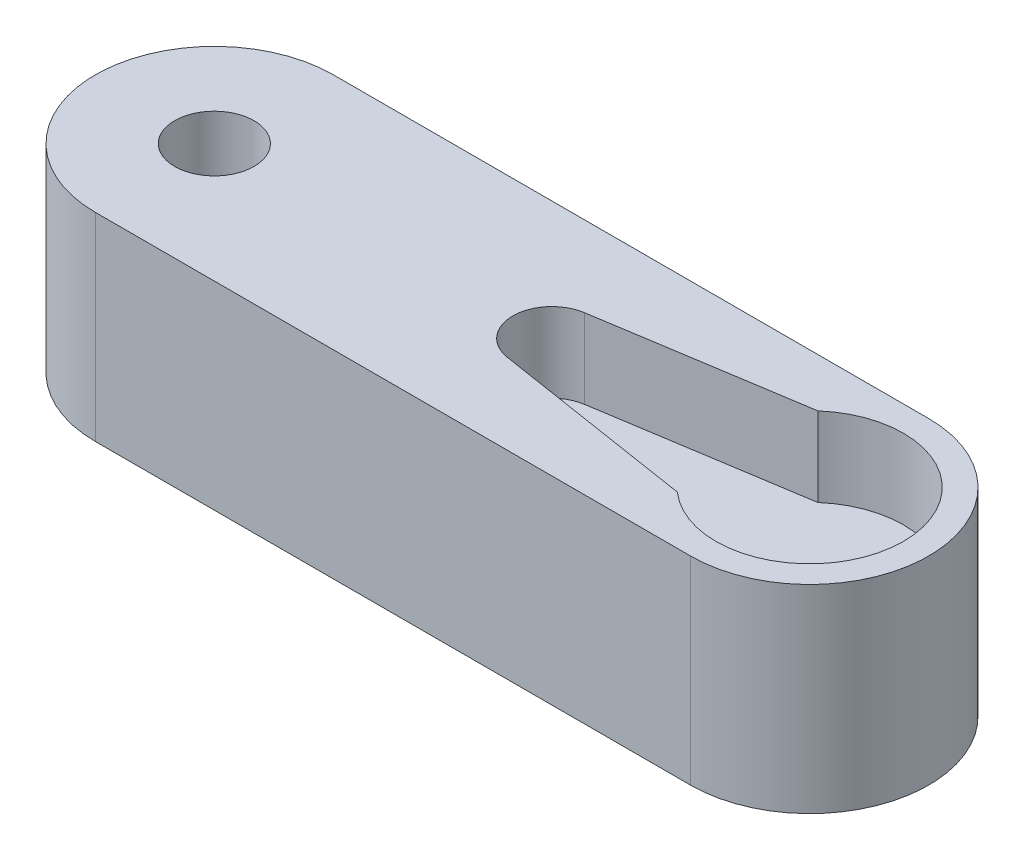
ISO-10303-21;
HEADER;
FILE_DESCRIPTION(('STEP AP214'),'2;1');
FILE_NAME('part.step','',(''),(''),'','','');
FILE_SCHEMA(('AUTOMOTIVE_DESIGN { 1 0 10303 214 1 1 1 1 }'));
ENDSEC;
DATA;
#1=APPLICATION_CONTEXT('core data for automotive mechanical design processes');
#2=APPLICATION_PROTOCOL_DEFINITION('international standard','automotive_design',2000,#1);
#3=PRODUCT_CONTEXT('',#1,'mechanical');
#4=PRODUCT('Part','Part','',(#3));
#5=PRODUCT_RELATED_PRODUCT_CATEGORY('part','',(#4));
#6=PRODUCT_DEFINITION_FORMATION('','',#4);
#7=PRODUCT_DEFINITION_CONTEXT('part definition',#1,'design');
#8=PRODUCT_DEFINITION('design','',#6,#7);
#9=PRODUCT_DEFINITION_SHAPE('','',#8);
#10=(LENGTH_UNIT() NAMED_UNIT(*) SI_UNIT(.MILLI.,.METRE.));
#11=(NAMED_UNIT(*) PLANE_ANGLE_UNIT() SI_UNIT($,.RADIAN.));
#12=(NAMED_UNIT(*) SI_UNIT($,.STERADIAN.) SOLID_ANGLE_UNIT());
#13=UNCERTAINTY_MEASURE_WITH_UNIT(LENGTH_MEASURE(1.E-05),#10,'distance_accuracy_value','');
#14=(GEOMETRIC_REPRESENTATION_CONTEXT(3) GLOBAL_UNCERTAINTY_ASSIGNED_CONTEXT((#13)) GLOBAL_UNIT_ASSIGNED_CONTEXT((#10,
#11,#12)) REPRESENTATION_CONTEXT('',''));
#15=CARTESIAN_POINT('',(0.,0.,0.));
#16=DIRECTION('',(0.,0.,1.));
#17=DIRECTION('',(1.,0.,0.));
#18=AXIS2_PLACEMENT_3D('',#15,#16,#17);
#19=CARTESIAN_POINT('',(-31.75,12.7,0.));
#20=DIRECTION('',(0.,-1.,0.));
#21=DIRECTION('',(0.,0.,-1.));
#22=AXIS2_PLACEMENT_3D('',#19,#20,#21);
#23=CYLINDRICAL_SURFACE('',#22,7.62);
#24=CARTESIAN_POINT('',(-31.75,0.,0.));
#25=DIRECTION('',(0.,1.,0.));
#26=DIRECTION('',(0.,0.,1.));
#27=AXIS2_PLACEMENT_3D('',#24,#25,#26);
#28=CIRCLE('',#27,7.62);
#29=CARTESIAN_POINT('',(-31.75,0.,-7.62));
#30=VERTEX_POINT('',#29);
#31=CARTESIAN_POINT('',(-31.75,0.,7.62));
#32=VERTEX_POINT('',#31);
#33=EDGE_CURVE('E154',#30,#32,#28,.T.);
#34=ORIENTED_EDGE('',*,*,#33,.T.);
#35=DIRECTION('',(0.,-1.,0.));
#36=VECTOR('',#35,1.);
#37=CARTESIAN_POINT('',(-31.75,12.7,7.62));
#38=LINE('',#37,#36);
#39=CARTESIAN_POINT('',(-31.75,12.7,7.62));
#40=VERTEX_POINT('',#39);
#41=EDGE_CURVE('E11',#40,#32,#38,.T.);
#42=ORIENTED_EDGE('',*,*,#41,.F.);
#43=CARTESIAN_POINT('',(-31.75,12.7,0.));
#44=DIRECTION('',(0.,1.,0.));
#45=DIRECTION('',(0.,0.,1.));
#46=AXIS2_PLACEMENT_3D('',#43,#44,#45);
#47=CIRCLE('',#46,7.62);
#48=CARTESIAN_POINT('',(-31.75,12.7,-7.62));
#49=VERTEX_POINT('',#48);
#50=EDGE_CURVE('E157',#49,#40,#47,.T.);
#51=ORIENTED_EDGE('',*,*,#50,.F.);
#52=DIRECTION('',(0.,-1.,0.));
#53=VECTOR('',#52,1.);
#54=CARTESIAN_POINT('',(-31.75,12.7,-7.62));
#55=LINE('',#54,#53);
#56=EDGE_CURVE('E163',#49,#30,#55,.T.);
#57=ORIENTED_EDGE('',*,*,#56,.T.);
#58=EDGE_LOOP('',(#34,#42,#51,#57));
#59=FACE_BOUND('',#58,.T.);
#60=ADVANCED_FACE('F39',(#59),#23,.T.);
#61=CARTESIAN_POINT('',(-31.75,12.7,7.62));
#62=DIRECTION('',(0.,0.,-1.));
#63=DIRECTION('',(-1.,0.,0.));
#64=AXIS2_PLACEMENT_3D('',#61,#62,#63);
#65=PLANE('',#64);
#66=DIRECTION('',(1.,0.,0.));
#67=VECTOR('',#66,1.);
#68=CARTESIAN_POINT('',(-31.75,0.,7.62));
#69=LINE('',#68,#67);
#70=CARTESIAN_POINT('',(6.35,0.,7.62));
#71=VERTEX_POINT('',#70);
#72=EDGE_CURVE('E166',#32,#71,#69,.T.);
#73=ORIENTED_EDGE('',*,*,#72,.T.);
#74=DIRECTION('',(0.,-1.,0.));
#75=VECTOR('',#74,1.);
#76=CARTESIAN_POINT('',(6.35,12.7,7.62));
#77=LINE('',#76,#75);
#78=CARTESIAN_POINT('',(6.35,12.7,7.62));
#79=VERTEX_POINT('',#78);
#80=EDGE_CURVE('E46',#79,#71,#77,.T.);
#81=ORIENTED_EDGE('',*,*,#80,.F.);
#82=DIRECTION('',(1.,0.,0.));
#83=VECTOR('',#82,1.);
#84=CARTESIAN_POINT('',(-31.75,12.7,7.62));
#85=LINE('',#84,#83);
#86=EDGE_CURVE('E90',#40,#79,#85,.T.);
#87=ORIENTED_EDGE('',*,*,#86,.F.);
#88=ORIENTED_EDGE('',*,*,#41,.T.);
#89=EDGE_LOOP('',(#73,#81,#87,#88));
#90=FACE_BOUND('',#89,.T.);
#91=ADVANCED_FACE('F196',(#90),#65,.F.);
#92=CARTESIAN_POINT('',(6.35,12.7,0.));
#93=DIRECTION('',(0.,-1.,0.));
#94=DIRECTION('',(0.,0.,-1.));
#95=AXIS2_PLACEMENT_3D('',#92,#93,#94);
#96=CYLINDRICAL_SURFACE('',#95,7.62);
#97=CARTESIAN_POINT('',(6.35,0.,0.));
#98=DIRECTION('',(0.,1.,0.));
#99=DIRECTION('',(0.,0.,1.));
#100=AXIS2_PLACEMENT_3D('',#97,#98,#99);
#101=CIRCLE('',#100,7.62);
#102=CARTESIAN_POINT('',(6.35,0.,-7.62));
#103=VERTEX_POINT('',#102);
#104=EDGE_CURVE('E168',#71,#103,#101,.T.);
#105=ORIENTED_EDGE('',*,*,#104,.T.);
#106=DIRECTION('',(0.,-1.,0.));
#107=VECTOR('',#106,1.);
#108=CARTESIAN_POINT('',(6.35,12.7,-7.62));
#109=LINE('',#108,#107);
#110=CARTESIAN_POINT('',(6.35,12.7,-7.62));
#111=VERTEX_POINT('',#110);
#112=EDGE_CURVE('E172',#111,#103,#109,.T.);
#113=ORIENTED_EDGE('',*,*,#112,.F.);
#114=CARTESIAN_POINT('',(6.35,12.7,0.));
#115=DIRECTION('',(0.,1.,0.));
#116=DIRECTION('',(0.,0.,1.));
#117=AXIS2_PLACEMENT_3D('',#114,#115,#116);
#118=CIRCLE('',#117,7.62);
#119=EDGE_CURVE('E160',#79,#111,#118,.T.);
#120=ORIENTED_EDGE('',*,*,#119,.F.);
#121=ORIENTED_EDGE('',*,*,#80,.T.);
#122=EDGE_LOOP('',(#105,#113,#120,#121));
#123=FACE_BOUND('',#122,.T.);
#124=ADVANCED_FACE('F177',(#123),#96,.T.);
#125=CARTESIAN_POINT('',(-31.75,12.7,-7.62));
#126=DIRECTION('',(0.,0.,1.));
#127=DIRECTION('',(1.,0.,0.));
#128=AXIS2_PLACEMENT_3D('',#125,#126,#127);
#129=PLANE('',#128);
#130=DIRECTION('',(-1.,0.,0.));
#131=VECTOR('',#130,1.);
#132=CARTESIAN_POINT('',(-31.75,0.,-7.62));
#133=LINE('',#132,#131);
#134=EDGE_CURVE('E83',#103,#30,#133,.T.);
#135=ORIENTED_EDGE('',*,*,#134,.T.);
#136=ORIENTED_EDGE('',*,*,#56,.F.);
#137=DIRECTION('',(-1.,0.,0.));
#138=VECTOR('',#137,1.);
#139=CARTESIAN_POINT('',(-31.75,12.7,-7.62));
#140=LINE('',#139,#138);
#141=EDGE_CURVE('E62',#111,#49,#140,.T.);
#142=ORIENTED_EDGE('',*,*,#141,.F.);
#143=ORIENTED_EDGE('',*,*,#112,.T.);
#144=EDGE_LOOP('',(#135,#136,#142,#143));
#145=FACE_BOUND('',#144,.T.);
#146=ADVANCED_FACE('F185',(#145),#129,.F.);
#147=CARTESIAN_POINT('',(-31.75,12.7,0.));
#148=DIRECTION('',(0.,1.,0.));
#149=DIRECTION('',(0.,0.,1.));
#150=AXIS2_PLACEMENT_3D('',#147,#148,#149);
#151=PLANE('',#150);
#152=CARTESIAN_POINT('',(-10.15000891,12.7,1.14864054843339E-13));
#153=DIRECTION('',(0.,1.,0.));
#154=DIRECTION('',(0.,0.,1.));
#155=AXIS2_PLACEMENT_3D('',#152,#153,#154);
#156=CIRCLE('',#155,2.50000135);
#157=CARTESIAN_POINT('',(-10.5381233173201,12.7,-2.46969106505892));
#158=VERTEX_POINT('',#157);
#159=CARTESIAN_POINT('',(-10.53812331732,12.7,2.46969106505915));
#160=VERTEX_POINT('',#159);
#161=EDGE_CURVE('E53',#158,#160,#156,.T.);
#162=ORIENTED_EDGE('',*,*,#161,.F.);
#163=DIRECTION('',(-0.987875892570632,0.,0.155245679095352));
#164=VECTOR('',#163,1.);
#165=CARTESIAN_POINT('',(2.38137089034439,12.7,-4.50000242999986));
#166=LINE('',#165,#164);
#167=CARTESIAN_POINT('',(2.38137089034439,12.7,-4.50000242999986));
#168=VERTEX_POINT('',#167);
#169=EDGE_CURVE('E132',#168,#158,#166,.T.);
#170=ORIENTED_EDGE('',*,*,#169,.F.);
#171=CARTESIAN_POINT('',(6.34999999999999,12.7,0.));
#172=DIRECTION('',(0.,1.,0.));
#173=DIRECTION('',(0.,0.,1.));
#174=AXIS2_PLACEMENT_3D('',#171,#172,#173);
#175=CIRCLE('',#174,6.00000323999999);
#176=CARTESIAN_POINT('',(2.38137089034458,12.7,4.50000243000003));
#177=VERTEX_POINT('',#176);
#178=EDGE_CURVE('E135',#177,#168,#175,.T.);
#179=ORIENTED_EDGE('',*,*,#178,.F.);
#180=DIRECTION('',(0.987875892570633,0.,0.155245679095345));
#181=VECTOR('',#180,1.);
#182=CARTESIAN_POINT('',(-10.53812331732,12.7,2.46969106505915));
#183=LINE('',#182,#181);
#184=EDGE_CURVE('E141',#160,#177,#183,.T.);
#185=ORIENTED_EDGE('',*,*,#184,.F.);
#186=EDGE_LOOP('',(#162,#170,#179,#185));
#187=FACE_BOUND('',#186,.T.);
#188=CARTESIAN_POINT('',(-31.75,12.7,0.));
#189=DIRECTION('',(0.,1.,0.));
#190=DIRECTION('',(0.,0.,1.));
#191=AXIS2_PLACEMENT_3D('',#188,#189,#190);
#192=CIRCLE('',#191,2.54);
#193=CARTESIAN_POINT('',(-31.75,12.7,2.54));
#194=VERTEX_POINT('',#193);
#195=EDGE_CURVE('E147',#194,#194,#192,.T.);
#196=ORIENTED_EDGE('',*,*,#195,.F.);
#197=EDGE_LOOP('',(#196));
#198=FACE_BOUND('',#197,.T.);
#199=ORIENTED_EDGE('',*,*,#50,.T.);
#200=ORIENTED_EDGE('',*,*,#86,.T.);
#201=ORIENTED_EDGE('',*,*,#119,.T.);
#202=ORIENTED_EDGE('',*,*,#141,.T.);
#203=EDGE_LOOP('',(#199,#200,#201,#202));
#204=FACE_BOUND('',#203,.T.);
#205=ADVANCED_FACE('F187',(#187,#198,#204),#151,.T.);
#206=CARTESIAN_POINT('',(-31.75,0.,0.));
#207=DIRECTION('',(0.,1.,0.));
#208=DIRECTION('',(0.,0.,1.));
#209=AXIS2_PLACEMENT_3D('',#206,#207,#208);
#210=PLANE('',#209);
#211=CARTESIAN_POINT('',(-31.75,0.,0.));
#212=DIRECTION('',(0.,1.,0.));
#213=DIRECTION('',(0.,0.,1.));
#214=AXIS2_PLACEMENT_3D('',#211,#212,#213);
#215=CIRCLE('',#214,2.54);
#216=CARTESIAN_POINT('',(-31.75,0.,2.54));
#217=VERTEX_POINT('',#216);
#218=EDGE_CURVE('E151',#217,#217,#215,.T.);
#219=ORIENTED_EDGE('',*,*,#218,.T.);
#220=EDGE_LOOP('',(#219));
#221=FACE_BOUND('',#220,.T.);
#222=ORIENTED_EDGE('',*,*,#33,.F.);
#223=ORIENTED_EDGE('',*,*,#134,.F.);
#224=ORIENTED_EDGE('',*,*,#104,.F.);
#225=ORIENTED_EDGE('',*,*,#72,.F.);
#226=EDGE_LOOP('',(#222,#223,#224,#225));
#227=FACE_BOUND('',#226,.T.);
#228=ADVANCED_FACE('F181',(#221,#227),#210,.F.);
#229=CARTESIAN_POINT('',(-31.75,0.,0.));
#230=DIRECTION('',(0.,1.,0.));
#231=DIRECTION('',(0.,0.,1.));
#232=AXIS2_PLACEMENT_3D('',#229,#230,#231);
#233=CYLINDRICAL_SURFACE('',#232,2.54);
#234=ORIENTED_EDGE('',*,*,#218,.F.);
#235=EDGE_LOOP('',(#234));
#236=FACE_BOUND('',#235,.T.);
#237=ORIENTED_EDGE('',*,*,#195,.T.);
#238=EDGE_LOOP('',(#237));
#239=FACE_BOUND('',#238,.T.);
#240=ADVANCED_FACE('F231',(#236,#239),#233,.F.);
#241=CARTESIAN_POINT('',(-10.15000891,7.62,1.14864054843339E-13));
#242=DIRECTION('',(0.,1.,0.));
#243=DIRECTION('',(0.,0.,1.));
#244=AXIS2_PLACEMENT_3D('',#241,#242,#243);
#245=CYLINDRICAL_SURFACE('',#244,2.50000135);
#246=ORIENTED_EDGE('',*,*,#161,.T.);
#247=DIRECTION('',(0.,1.,0.));
#248=VECTOR('',#247,1.);
#249=CARTESIAN_POINT('',(-10.53812331732,7.62,2.46969106505915));
#250=LINE('',#249,#248);
#251=CARTESIAN_POINT('',(-10.53812331732,7.62,2.46969106505915));
#252=VERTEX_POINT('',#251);
#253=EDGE_CURVE('E110',#252,#160,#250,.T.);
#254=ORIENTED_EDGE('',*,*,#253,.F.);
#255=CARTESIAN_POINT('',(-10.15000891,7.62,1.14864054843339E-13));
#256=DIRECTION('',(0.,1.,0.));
#257=DIRECTION('',(0.,0.,1.));
#258=AXIS2_PLACEMENT_3D('',#255,#256,#257);
#259=CIRCLE('',#258,2.50000135);
#260=CARTESIAN_POINT('',(-10.5381233173201,7.62,-2.46969106505892));
#261=VERTEX_POINT('',#260);
#262=EDGE_CURVE('E114',#261,#252,#259,.T.);
#263=ORIENTED_EDGE('',*,*,#262,.F.);
#264=DIRECTION('',(0.,1.,0.));
#265=VECTOR('',#264,1.);
#266=CARTESIAN_POINT('',(-10.5381233173201,7.62,-2.46969106505892));
#267=LINE('',#266,#265);
#268=EDGE_CURVE('E145',#261,#158,#267,.T.);
#269=ORIENTED_EDGE('',*,*,#268,.T.);
#270=EDGE_LOOP('',(#246,#254,#263,#269));
#271=FACE_BOUND('',#270,.T.);
#272=ADVANCED_FACE('F112',(#271),#245,.F.);
#273=CARTESIAN_POINT('',(2.38137089034439,7.62,-4.50000242999986));
#274=DIRECTION('',(-0.155245679095352,0.,-0.987875892570632));
#275=DIRECTION('',(-0.987875892570632,0.,0.155245679095352));
#276=AXIS2_PLACEMENT_3D('',#273,#274,#275);
#277=PLANE('',#276);
#278=ORIENTED_EDGE('',*,*,#169,.T.);
#279=ORIENTED_EDGE('',*,*,#268,.F.);
#280=DIRECTION('',(-0.987875892570632,0.,0.155245679095352));
#281=VECTOR('',#280,1.);
#282=CARTESIAN_POINT('',(2.38137089034439,7.62,-4.50000242999986));
#283=LINE('',#282,#281);
#284=CARTESIAN_POINT('',(2.38137089034439,7.62,-4.50000242999986));
#285=VERTEX_POINT('',#284);
#286=EDGE_CURVE('E120',#285,#261,#283,.T.);
#287=ORIENTED_EDGE('',*,*,#286,.F.);
#288=DIRECTION('',(0.,1.,0.));
#289=VECTOR('',#288,1.);
#290=CARTESIAN_POINT('',(2.38137089034439,7.62,-4.50000242999986));
#291=LINE('',#290,#289);
#292=EDGE_CURVE('E148',#285,#168,#291,.T.);
#293=ORIENTED_EDGE('',*,*,#292,.T.);
#294=EDGE_LOOP('',(#278,#279,#287,#293));
#295=FACE_BOUND('',#294,.T.);
#296=ADVANCED_FACE('F247',(#295),#277,.F.);
#297=CARTESIAN_POINT('',(6.34999999999999,7.62,0.));
#298=DIRECTION('',(0.,1.,0.));
#299=DIRECTION('',(0.,0.,1.));
#300=AXIS2_PLACEMENT_3D('',#297,#298,#299);
#301=CYLINDRICAL_SURFACE('',#300,6.00000323999999);
#302=ORIENTED_EDGE('',*,*,#178,.T.);
#303=ORIENTED_EDGE('',*,*,#292,.F.);
#304=CARTESIAN_POINT('',(6.34999999999999,7.62,0.));
#305=DIRECTION('',(0.,1.,0.));
#306=DIRECTION('',(0.,0.,1.));
#307=AXIS2_PLACEMENT_3D('',#304,#305,#306);
#308=CIRCLE('',#307,6.00000323999999);
#309=CARTESIAN_POINT('',(2.38137089034458,7.62,4.50000243000003));
#310=VERTEX_POINT('',#309);
#311=EDGE_CURVE('E128',#310,#285,#308,.T.);
#312=ORIENTED_EDGE('',*,*,#311,.F.);
#313=DIRECTION('',(0.,1.,0.));
#314=VECTOR('',#313,1.);
#315=CARTESIAN_POINT('',(2.38137089034458,7.62,4.50000243000003));
#316=LINE('',#315,#314);
#317=EDGE_CURVE('E119',#310,#177,#316,.T.);
#318=ORIENTED_EDGE('',*,*,#317,.T.);
#319=EDGE_LOOP('',(#302,#303,#312,#318));
#320=FACE_BOUND('',#319,.T.);
#321=ADVANCED_FACE('F256',(#320),#301,.F.);
#322=CARTESIAN_POINT('',(-10.53812331732,7.62,2.46969106505915));
#323=DIRECTION('',(-0.155245679095345,0.,0.987875892570633));
#324=DIRECTION('',(0.987875892570633,0.,0.155245679095345));
#325=AXIS2_PLACEMENT_3D('',#322,#323,#324);
#326=PLANE('',#325);
#327=ORIENTED_EDGE('',*,*,#184,.T.);
#328=ORIENTED_EDGE('',*,*,#317,.F.);
#329=DIRECTION('',(0.987875892570633,0.,0.155245679095345));
#330=VECTOR('',#329,1.);
#331=CARTESIAN_POINT('',(-10.53812331732,7.62,2.46969106505915));
#332=LINE('',#331,#330);
#333=EDGE_CURVE('E123',#252,#310,#332,.T.);
#334=ORIENTED_EDGE('',*,*,#333,.F.);
#335=ORIENTED_EDGE('',*,*,#253,.T.);
#336=EDGE_LOOP('',(#327,#328,#334,#335));
#337=FACE_BOUND('',#336,.T.);
#338=ADVANCED_FACE('F124',(#337),#326,.F.);
#339=CARTESIAN_POINT('',(-10.15000891,7.62,1.14864054843339E-13));
#340=DIRECTION('',(0.,1.,0.));
#341=DIRECTION('',(0.,0.,1.));
#342=AXIS2_PLACEMENT_3D('',#339,#340,#341);
#343=PLANE('',#342);
#344=ORIENTED_EDGE('',*,*,#262,.T.);
#345=ORIENTED_EDGE('',*,*,#333,.T.);
#346=ORIENTED_EDGE('',*,*,#311,.T.);
#347=ORIENTED_EDGE('',*,*,#286,.T.);
#348=EDGE_LOOP('',(#344,#345,#346,#347));
#349=FACE_BOUND('',#348,.T.);
#350=ADVANCED_FACE('F130',(#349),#343,.T.);
#351=CLOSED_SHELL('',(#60,#91,#124,#146,#205,#228,#240,#272,#296,#321,#338,#350));
#352=MANIFOLD_SOLID_BREP('B2',#351);
#353=ADVANCED_BREP_SHAPE_REPRESENTATION('',(#18,#352),#14);
#354=SHAPE_DEFINITION_REPRESENTATION(#9,#353);
ENDSEC;
END-ISO-10303-21;
